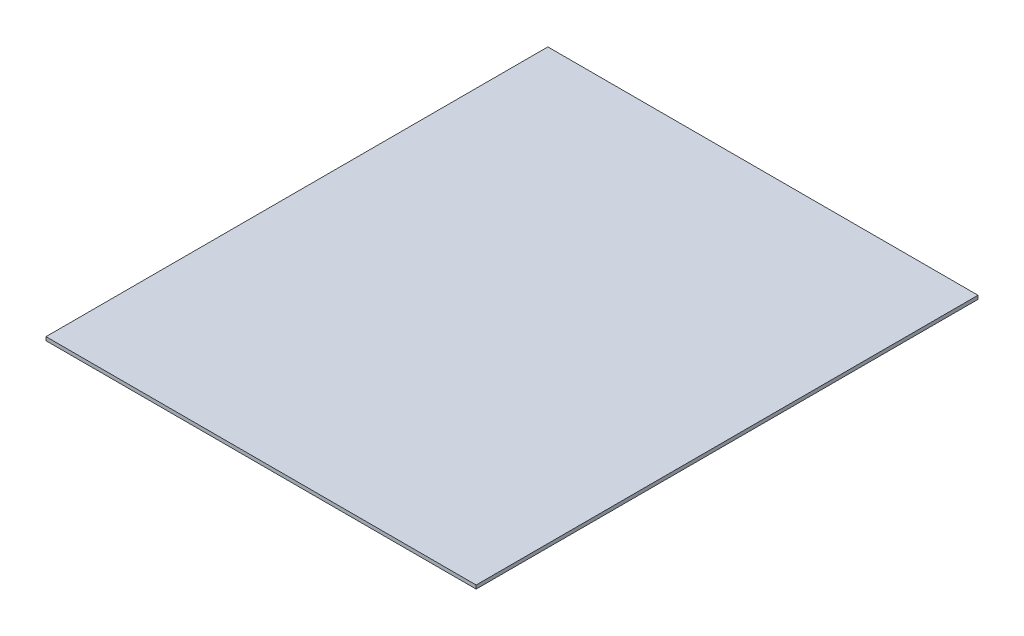
ISO-10303-21;
HEADER;
FILE_DESCRIPTION(('STEP AP214'),'2;1');
FILE_NAME('part.step','',(''),(''),'','','');
FILE_SCHEMA(('AUTOMOTIVE_DESIGN { 1 0 10303 214 1 1 1 1 }'));
ENDSEC;
DATA;
#1=APPLICATION_CONTEXT('core data for automotive mechanical design processes');
#2=APPLICATION_PROTOCOL_DEFINITION('international standard','automotive_design',2000,#1);
#3=PRODUCT_CONTEXT('',#1,'mechanical');
#4=PRODUCT('Part','Part','',(#3));
#5=PRODUCT_RELATED_PRODUCT_CATEGORY('part','',(#4));
#6=PRODUCT_DEFINITION_FORMATION('','',#4);
#7=PRODUCT_DEFINITION_CONTEXT('part definition',#1,'design');
#8=PRODUCT_DEFINITION('design','',#6,#7);
#9=PRODUCT_DEFINITION_SHAPE('','',#8);
#10=(LENGTH_UNIT() NAMED_UNIT(*) SI_UNIT(.MILLI.,.METRE.));
#11=(NAMED_UNIT(*) PLANE_ANGLE_UNIT() SI_UNIT($,.RADIAN.));
#12=(NAMED_UNIT(*) SI_UNIT($,.STERADIAN.) SOLID_ANGLE_UNIT());
#13=UNCERTAINTY_MEASURE_WITH_UNIT(LENGTH_MEASURE(1.E-05),#10,'distance_accuracy_value','');
#14=(GEOMETRIC_REPRESENTATION_CONTEXT(3) GLOBAL_UNCERTAINTY_ASSIGNED_CONTEXT((#13)) GLOBAL_UNIT_ASSIGNED_CONTEXT((#10,
#11,#12)) REPRESENTATION_CONTEXT('',''));
#15=CARTESIAN_POINT('',(0.,0.,0.));
#16=DIRECTION('',(0.,0.,1.));
#17=DIRECTION('',(1.,0.,0.));
#18=AXIS2_PLACEMENT_3D('',#15,#16,#17);
#19=CARTESIAN_POINT('',(600.,10.,700.));
#20=DIRECTION('',(-1.,0.,0.));
#21=DIRECTION('',(0.,0.,1.));
#22=AXIS2_PLACEMENT_3D('',#19,#20,#21);
#23=PLANE('',#22);
#24=DIRECTION('',(0.,0.,-1.));
#25=VECTOR('',#24,1.);
#26=CARTESIAN_POINT('',(600.,0.,700.));
#27=LINE('',#26,#25);
#28=CARTESIAN_POINT('',(600.,0.,700.));
#29=VERTEX_POINT('',#28);
#30=CARTESIAN_POINT('',(600.,0.,-700.));
#31=VERTEX_POINT('',#30);
#32=EDGE_CURVE('E100',#29,#31,#27,.T.);
#33=ORIENTED_EDGE('',*,*,#32,.T.);
#34=DIRECTION('',(0.,-1.,0.));
#35=VECTOR('',#34,1.);
#36=CARTESIAN_POINT('',(600.,10.,-700.));
#37=LINE('',#36,#35);
#38=CARTESIAN_POINT('',(600.,10.,-700.));
#39=VERTEX_POINT('',#38);
#40=EDGE_CURVE('E11',#39,#31,#37,.T.);
#41=ORIENTED_EDGE('',*,*,#40,.F.);
#42=DIRECTION('',(0.,0.,-1.));
#43=VECTOR('',#42,1.);
#44=CARTESIAN_POINT('',(600.,10.,700.));
#45=LINE('',#44,#43);
#46=CARTESIAN_POINT('',(600.,10.,700.));
#47=VERTEX_POINT('',#46);
#48=EDGE_CURVE('E88',#47,#39,#45,.T.);
#49=ORIENTED_EDGE('',*,*,#48,.F.);
#50=DIRECTION('',(0.,-1.,0.));
#51=VECTOR('',#50,1.);
#52=CARTESIAN_POINT('',(600.,10.,700.));
#53=LINE('',#52,#51);
#54=EDGE_CURVE('E96',#47,#29,#53,.T.);
#55=ORIENTED_EDGE('',*,*,#54,.T.);
#56=EDGE_LOOP('',(#33,#41,#49,#55));
#57=FACE_BOUND('',#56,.T.);
#58=ADVANCED_FACE('F37',(#57),#23,.F.);
#59=CARTESIAN_POINT('',(-600.,10.,-700.));
#60=DIRECTION('',(0.,0.,1.));
#61=DIRECTION('',(1.,0.,0.));
#62=AXIS2_PLACEMENT_3D('',#59,#60,#61);
#63=PLANE('',#62);
#64=DIRECTION('',(-1.,0.,0.));
#65=VECTOR('',#64,1.);
#66=CARTESIAN_POINT('',(-600.,0.,-700.));
#67=LINE('',#66,#65);
#68=CARTESIAN_POINT('',(-600.,0.,-700.));
#69=VERTEX_POINT('',#68);
#70=EDGE_CURVE('E92',#31,#69,#67,.T.);
#71=ORIENTED_EDGE('',*,*,#70,.T.);
#72=DIRECTION('',(0.,-1.,0.));
#73=VECTOR('',#72,1.);
#74=CARTESIAN_POINT('',(-600.,10.,-700.));
#75=LINE('',#74,#73);
#76=CARTESIAN_POINT('',(-600.,10.,-700.));
#77=VERTEX_POINT('',#76);
#78=EDGE_CURVE('E45',#77,#69,#75,.T.);
#79=ORIENTED_EDGE('',*,*,#78,.F.);
#80=DIRECTION('',(-1.,0.,0.));
#81=VECTOR('',#80,1.);
#82=CARTESIAN_POINT('',(-600.,10.,-700.));
#83=LINE('',#82,#81);
#84=EDGE_CURVE('E83',#39,#77,#83,.T.);
#85=ORIENTED_EDGE('',*,*,#84,.F.);
#86=ORIENTED_EDGE('',*,*,#40,.T.);
#87=EDGE_LOOP('',(#71,#79,#85,#86));
#88=FACE_BOUND('',#87,.T.);
#89=ADVANCED_FACE('F91',(#88),#63,.F.);
#90=CARTESIAN_POINT('',(-600.,10.,700.));
#91=DIRECTION('',(1.,0.,0.));
#92=DIRECTION('',(0.,0.,-1.));
#93=AXIS2_PLACEMENT_3D('',#90,#91,#92);
#94=PLANE('',#93);
#95=DIRECTION('',(0.,0.,1.));
#96=VECTOR('',#95,1.);
#97=CARTESIAN_POINT('',(-600.,0.,700.));
#98=LINE('',#97,#96);
#99=CARTESIAN_POINT('',(-600.,0.,700.));
#100=VERTEX_POINT('',#99);
#101=EDGE_CURVE('E70',#69,#100,#98,.T.);
#102=ORIENTED_EDGE('',*,*,#101,.T.);
#103=DIRECTION('',(0.,-1.,0.));
#104=VECTOR('',#103,1.);
#105=CARTESIAN_POINT('',(-600.,10.,700.));
#106=LINE('',#105,#104);
#107=CARTESIAN_POINT('',(-600.,10.,700.));
#108=VERTEX_POINT('',#107);
#109=EDGE_CURVE('E93',#108,#100,#106,.T.);
#110=ORIENTED_EDGE('',*,*,#109,.F.);
#111=DIRECTION('',(0.,0.,1.));
#112=VECTOR('',#111,1.);
#113=CARTESIAN_POINT('',(-600.,10.,700.));
#114=LINE('',#113,#112);
#115=EDGE_CURVE('E86',#77,#108,#114,.T.);
#116=ORIENTED_EDGE('',*,*,#115,.F.);
#117=ORIENTED_EDGE('',*,*,#78,.T.);
#118=EDGE_LOOP('',(#102,#110,#116,#117));
#119=FACE_BOUND('',#118,.T.);
#120=ADVANCED_FACE('F94',(#119),#94,.F.);
#121=CARTESIAN_POINT('',(-600.,10.,700.));
#122=DIRECTION('',(0.,0.,-1.));
#123=DIRECTION('',(-1.,0.,0.));
#124=AXIS2_PLACEMENT_3D('',#121,#122,#123);
#125=PLANE('',#124);
#126=DIRECTION('',(1.,0.,0.));
#127=VECTOR('',#126,1.);
#128=CARTESIAN_POINT('',(-600.,0.,700.));
#129=LINE('',#128,#127);
#130=EDGE_CURVE('E76',#100,#29,#129,.T.);
#131=ORIENTED_EDGE('',*,*,#130,.T.);
#132=ORIENTED_EDGE('',*,*,#54,.F.);
#133=DIRECTION('',(1.,0.,0.));
#134=VECTOR('',#133,1.);
#135=CARTESIAN_POINT('',(-600.,10.,700.));
#136=LINE('',#135,#134);
#137=EDGE_CURVE('E53',#108,#47,#136,.T.);
#138=ORIENTED_EDGE('',*,*,#137,.F.);
#139=ORIENTED_EDGE('',*,*,#109,.T.);
#140=EDGE_LOOP('',(#131,#132,#138,#139));
#141=FACE_BOUND('',#140,.T.);
#142=ADVANCED_FACE('F107',(#141),#125,.F.);
#143=CARTESIAN_POINT('',(0.,10.,0.));
#144=DIRECTION('',(0.,-1.,0.));
#145=DIRECTION('',(0.,0.,-1.));
#146=AXIS2_PLACEMENT_3D('',#143,#144,#145);
#147=PLANE('',#146);
#148=ORIENTED_EDGE('',*,*,#48,.T.);
#149=ORIENTED_EDGE('',*,*,#84,.T.);
#150=ORIENTED_EDGE('',*,*,#115,.T.);
#151=ORIENTED_EDGE('',*,*,#137,.T.);
#152=EDGE_LOOP('',(#148,#149,#150,#151));
#153=FACE_BOUND('',#152,.T.);
#154=ADVANCED_FACE('F84',(#153),#147,.F.);
#155=CARTESIAN_POINT('',(0.,0.,0.));
#156=DIRECTION('',(0.,-1.,0.));
#157=DIRECTION('',(0.,0.,-1.));
#158=AXIS2_PLACEMENT_3D('',#155,#156,#157);
#159=PLANE('',#158);
#160=ORIENTED_EDGE('',*,*,#32,.F.);
#161=ORIENTED_EDGE('',*,*,#130,.F.);
#162=ORIENTED_EDGE('',*,*,#101,.F.);
#163=ORIENTED_EDGE('',*,*,#70,.F.);
#164=EDGE_LOOP('',(#160,#161,#162,#163));
#165=FACE_BOUND('',#164,.T.);
#166=ADVANCED_FACE('F110',(#165),#159,.T.);
#167=CLOSED_SHELL('',(#58,#89,#120,#142,#154,#166));
#168=MANIFOLD_SOLID_BREP('B2',#167);
#169=ADVANCED_BREP_SHAPE_REPRESENTATION('',(#18,#168),#14);
#170=SHAPE_DEFINITION_REPRESENTATION(#9,#169);
ENDSEC;
END-ISO-10303-21;
